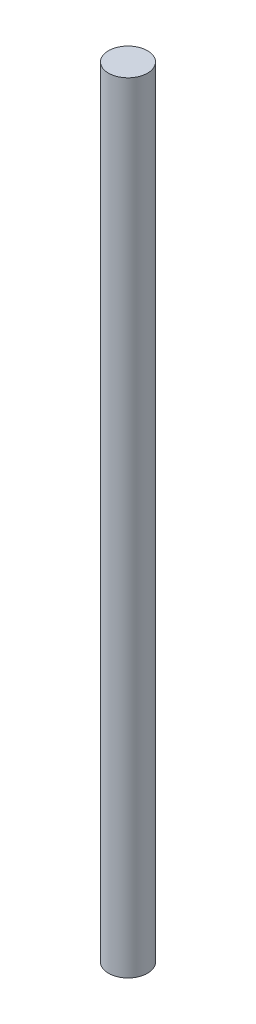
ISO-10303-21;
HEADER;
FILE_DESCRIPTION(('STEP AP214'),'2;1');
FILE_NAME('part.step','',(''),(''),'','','');
FILE_SCHEMA(('AUTOMOTIVE_DESIGN { 1 0 10303 214 1 1 1 1 }'));
ENDSEC;
DATA;
#1=APPLICATION_CONTEXT('core data for automotive mechanical design processes');
#2=APPLICATION_PROTOCOL_DEFINITION('international standard','automotive_design',2000,#1);
#3=PRODUCT_CONTEXT('',#1,'mechanical');
#4=PRODUCT('Part','Part','',(#3));
#5=PRODUCT_RELATED_PRODUCT_CATEGORY('part','',(#4));
#6=PRODUCT_DEFINITION_FORMATION('','',#4);
#7=PRODUCT_DEFINITION_CONTEXT('part definition',#1,'design');
#8=PRODUCT_DEFINITION('design','',#6,#7);
#9=PRODUCT_DEFINITION_SHAPE('','',#8);
#10=(LENGTH_UNIT() NAMED_UNIT(*) SI_UNIT(.MILLI.,.METRE.));
#11=(NAMED_UNIT(*) PLANE_ANGLE_UNIT() SI_UNIT($,.RADIAN.));
#12=(NAMED_UNIT(*) SI_UNIT($,.STERADIAN.) SOLID_ANGLE_UNIT());
#13=UNCERTAINTY_MEASURE_WITH_UNIT(LENGTH_MEASURE(1.E-05),#10,'distance_accuracy_value','');
#14=(GEOMETRIC_REPRESENTATION_CONTEXT(3) GLOBAL_UNCERTAINTY_ASSIGNED_CONTEXT((#13)) GLOBAL_UNIT_ASSIGNED_CONTEXT((#10,
#11,#12)) REPRESENTATION_CONTEXT('',''));
#15=CARTESIAN_POINT('',(0.,0.,0.));
#16=DIRECTION('',(0.,0.,1.));
#17=DIRECTION('',(1.,0.,0.));
#18=AXIS2_PLACEMENT_3D('',#15,#16,#17);
#19=CARTESIAN_POINT('',(-5.32682283546771,120.,0.));
#20=DIRECTION('',(0.,-1.,0.));
#21=DIRECTION('',(0.,0.,-1.));
#22=AXIS2_PLACEMENT_3D('',#19,#20,#21);
#23=CYLINDRICAL_SURFACE('',#22,3.);
#24=CARTESIAN_POINT('',(-5.32682283546771,120.,0.));
#25=DIRECTION('',(0.,1.,0.));
#26=DIRECTION('',(0.,0.,1.));
#27=AXIS2_PLACEMENT_3D('',#24,#25,#26);
#28=CIRCLE('',#27,3.);
#29=CARTESIAN_POINT('',(-5.32682283546771,120.,3.));
#30=VERTEX_POINT('',#29);
#31=EDGE_CURVE('E10',#30,#30,#28,.T.);
#32=ORIENTED_EDGE('',*,*,#31,.F.);
#33=EDGE_LOOP('',(#32));
#34=FACE_BOUND('',#33,.T.);
#35=CARTESIAN_POINT('',(-5.32682283546771,0.,0.));
#36=DIRECTION('',(0.,1.,0.));
#37=DIRECTION('',(0.,0.,1.));
#38=AXIS2_PLACEMENT_3D('',#35,#36,#37);
#39=CIRCLE('',#38,3.);
#40=CARTESIAN_POINT('',(-5.32682283546771,0.,3.));
#41=VERTEX_POINT('',#40);
#42=EDGE_CURVE('E34',#41,#41,#39,.T.);
#43=ORIENTED_EDGE('',*,*,#42,.T.);
#44=EDGE_LOOP('',(#43));
#45=FACE_BOUND('',#44,.T.);
#46=ADVANCED_FACE('F31',(#34,#45),#23,.T.);
#47=CARTESIAN_POINT('',(-5.32682283546771,120.,0.));
#48=DIRECTION('',(0.,1.,0.));
#49=DIRECTION('',(0.,0.,1.));
#50=AXIS2_PLACEMENT_3D('',#47,#48,#49);
#51=PLANE('',#50);
#52=ORIENTED_EDGE('',*,*,#31,.T.);
#53=EDGE_LOOP('',(#52));
#54=FACE_BOUND('',#53,.T.);
#55=ADVANCED_FACE('F46',(#54),#51,.T.);
#56=CARTESIAN_POINT('',(-5.32682283546771,0.,0.));
#57=DIRECTION('',(0.,1.,0.));
#58=DIRECTION('',(0.,0.,1.));
#59=AXIS2_PLACEMENT_3D('',#56,#57,#58);
#60=PLANE('',#59);
#61=ORIENTED_EDGE('',*,*,#42,.F.);
#62=EDGE_LOOP('',(#61));
#63=FACE_BOUND('',#62,.T.);
#64=ADVANCED_FACE('F44',(#63),#60,.F.);
#65=CLOSED_SHELL('',(#46,#55,#64));
#66=MANIFOLD_SOLID_BREP('B2',#65);
#67=ADVANCED_BREP_SHAPE_REPRESENTATION('',(#18,#66),#14);
#68=SHAPE_DEFINITION_REPRESENTATION(#9,#67);
ENDSEC;
END-ISO-10303-21;
